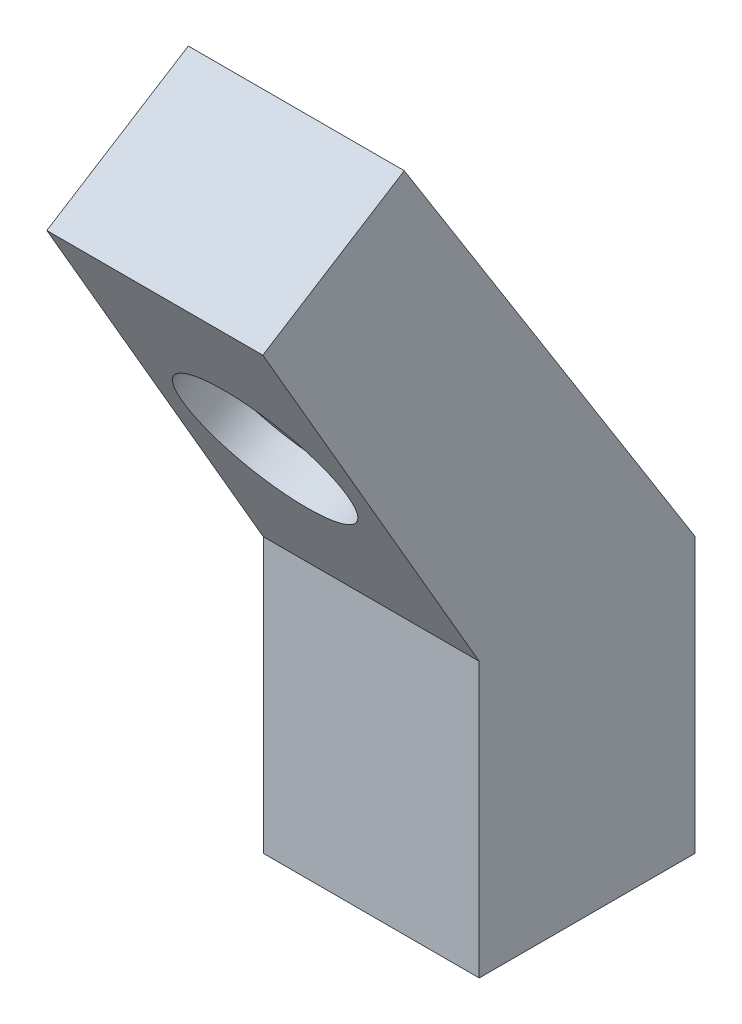
ISO-10303-21;
HEADER;
FILE_DESCRIPTION(('STEP AP214'),'2;1');
FILE_NAME('part.step','',(''),(''),'','','');
FILE_SCHEMA(('AUTOMOTIVE_DESIGN { 1 0 10303 214 1 1 1 1 }'));
ENDSEC;
DATA;
#1=APPLICATION_CONTEXT('core data for automotive mechanical design processes');
#2=APPLICATION_PROTOCOL_DEFINITION('international standard','automotive_design',2000,#1);
#3=PRODUCT_CONTEXT('',#1,'mechanical');
#4=PRODUCT('Part','Part','',(#3));
#5=PRODUCT_RELATED_PRODUCT_CATEGORY('part','',(#4));
#6=PRODUCT_DEFINITION_FORMATION('','',#4);
#7=PRODUCT_DEFINITION_CONTEXT('part definition',#1,'design');
#8=PRODUCT_DEFINITION('design','',#6,#7);
#9=PRODUCT_DEFINITION_SHAPE('','',#8);
#10=(LENGTH_UNIT() NAMED_UNIT(*) SI_UNIT(.MILLI.,.METRE.));
#11=(NAMED_UNIT(*) PLANE_ANGLE_UNIT() SI_UNIT($,.RADIAN.));
#12=(NAMED_UNIT(*) SI_UNIT($,.STERADIAN.) SOLID_ANGLE_UNIT());
#13=UNCERTAINTY_MEASURE_WITH_UNIT(LENGTH_MEASURE(1.E-05),#10,'distance_accuracy_value','');
#14=(GEOMETRIC_REPRESENTATION_CONTEXT(3) GLOBAL_UNCERTAINTY_ASSIGNED_CONTEXT((#13)) GLOBAL_UNIT_ASSIGNED_CONTEXT((#10,
#11,#12)) REPRESENTATION_CONTEXT('',''));
#15=CARTESIAN_POINT('',(0.,0.,0.));
#16=DIRECTION('',(0.,0.,1.));
#17=DIRECTION('',(1.,0.,0.));
#18=AXIS2_PLACEMENT_3D('',#15,#16,#17);
#19=CARTESIAN_POINT('',(-80.,203.2,0.));
#20=DIRECTION('',(1.,0.,0.));
#21=DIRECTION('',(0.,0.,-1.));
#22=AXIS2_PLACEMENT_3D('',#19,#20,#21);
#23=PLANE('',#22);
#24=DIRECTION('',(0.,0.,1.));
#25=VECTOR('',#24,1.);
#26=CARTESIAN_POINT('',(-80.,0.,0.));
#27=LINE('',#26,#25);
#28=CARTESIAN_POINT('',(-80.,0.,-80.));
#29=VERTEX_POINT('',#28);
#30=CARTESIAN_POINT('',(-80.,0.,80.));
#31=VERTEX_POINT('',#30);
#32=EDGE_CURVE('E82',#29,#31,#27,.T.);
#33=ORIENTED_EDGE('',*,*,#32,.T.);
#34=DIRECTION('',(0.,-1.,0.));
#35=VECTOR('',#34,1.);
#36=CARTESIAN_POINT('',(-80.,203.2,80.));
#37=LINE('',#36,#35);
#38=CARTESIAN_POINT('',(-80.,203.2,80.));
#39=VERTEX_POINT('',#38);
#40=EDGE_CURVE('E11',#39,#31,#37,.T.);
#41=ORIENTED_EDGE('',*,*,#40,.F.);
#42=DIRECTION('',(0.,0.,1.));
#43=VECTOR('',#42,1.);
#44=CARTESIAN_POINT('',(-80.,203.2,-80.));
#45=LINE('',#44,#43);
#46=CARTESIAN_POINT('',(-80.,203.2,-80.));
#47=VERTEX_POINT('',#46);
#48=EDGE_CURVE('E167',#47,#39,#45,.T.);
#49=ORIENTED_EDGE('',*,*,#48,.F.);
#50=DIRECTION('',(0.,-1.,0.));
#51=VECTOR('',#50,1.);
#52=CARTESIAN_POINT('',(-80.,203.2,-80.));
#53=LINE('',#52,#51);
#54=EDGE_CURVE('E62',#47,#29,#53,.T.);
#55=ORIENTED_EDGE('',*,*,#54,.T.);
#56=EDGE_LOOP('',(#33,#41,#49,#55));
#57=FACE_BOUND('',#56,.T.);
#58=ADVANCED_FACE('F45',(#57),#23,.F.);
#59=CARTESIAN_POINT('',(80.,203.2,80.));
#60=DIRECTION('',(0.,0.,1.));
#61=DIRECTION('',(1.,0.,0.));
#62=AXIS2_PLACEMENT_3D('',#59,#60,#61);
#63=PLANE('',#62);
#64=DIRECTION('',(-1.,0.,0.));
#65=VECTOR('',#64,1.);
#66=CARTESIAN_POINT('',(80.,0.,80.));
#67=LINE('',#66,#65);
#68=CARTESIAN_POINT('',(80.,0.,80.));
#69=VERTEX_POINT('',#68);
#70=EDGE_CURVE('E180',#69,#31,#67,.T.);
#71=ORIENTED_EDGE('',*,*,#70,.F.);
#72=DIRECTION('',(0.,-1.,0.));
#73=VECTOR('',#72,1.);
#74=CARTESIAN_POINT('',(80.,203.2,80.));
#75=LINE('',#74,#73);
#76=CARTESIAN_POINT('',(80.,203.2,80.));
#77=VERTEX_POINT('',#76);
#78=EDGE_CURVE('E54',#77,#69,#75,.T.);
#79=ORIENTED_EDGE('',*,*,#78,.F.);
#80=DIRECTION('',(1.,0.,0.));
#81=VECTOR('',#80,1.);
#82=CARTESIAN_POINT('',(-80.,203.2,80.));
#83=LINE('',#82,#81);
#84=EDGE_CURVE('E171',#39,#77,#83,.T.);
#85=ORIENTED_EDGE('',*,*,#84,.F.);
#86=ORIENTED_EDGE('',*,*,#40,.T.);
#87=EDGE_LOOP('',(#71,#79,#85,#86));
#88=FACE_BOUND('',#87,.T.);
#89=ADVANCED_FACE('F196',(#88),#63,.T.);
#90=CARTESIAN_POINT('',(80.,203.2,0.));
#91=DIRECTION('',(-1.,0.,0.));
#92=DIRECTION('',(0.,0.,1.));
#93=AXIS2_PLACEMENT_3D('',#90,#91,#92);
#94=PLANE('',#93);
#95=DIRECTION('',(0.,0.,-1.));
#96=VECTOR('',#95,1.);
#97=CARTESIAN_POINT('',(80.,0.,0.));
#98=LINE('',#97,#96);
#99=CARTESIAN_POINT('',(80.,0.,-80.));
#100=VERTEX_POINT('',#99);
#101=EDGE_CURVE('E183',#69,#100,#98,.T.);
#102=ORIENTED_EDGE('',*,*,#101,.T.);
#103=DIRECTION('',(0.,-1.,0.));
#104=VECTOR('',#103,1.);
#105=CARTESIAN_POINT('',(80.,203.2,-80.));
#106=LINE('',#105,#104);
#107=CARTESIAN_POINT('',(80.,203.2,-80.));
#108=VERTEX_POINT('',#107);
#109=EDGE_CURVE('E190',#108,#100,#106,.T.);
#110=ORIENTED_EDGE('',*,*,#109,.F.);
#111=DIRECTION('',(0.,0.846387073175883,0.532568232586926));
#112=VECTOR('',#111,1.);
#113=CARTESIAN_POINT('',(80.,203.2,-80.));
#114=LINE('',#113,#112);
#115=CARTESIAN_POINT('',(80.,545.72614690566,135.52614690566));
#116=VERTEX_POINT('',#115);
#117=EDGE_CURVE('E140',#108,#116,#114,.T.);
#118=ORIENTED_EDGE('',*,*,#117,.T.);
#119=DIRECTION('',(0.,-0.532568232586926,0.846387073175883));
#120=VECTOR('',#119,1.);
#121=CARTESIAN_POINT('',(80.,545.72614690566,135.52614690566));
#122=LINE('',#121,#120);
#123=CARTESIAN_POINT('',(80.,479.77624244122,240.337405257941));
#124=VERTEX_POINT('',#123);
#125=EDGE_CURVE('E153',#116,#124,#122,.T.);
#126=ORIENTED_EDGE('',*,*,#125,.T.);
#127=DIRECTION('',(0.,-0.865135452449461,-0.501538282601704));
#128=VECTOR('',#127,1.);
#129=CARTESIAN_POINT('',(80.,479.77624244122,240.337405257941));
#130=LINE('',#129,#128);
#131=EDGE_CURVE('E117',#124,#77,#130,.T.);
#132=ORIENTED_EDGE('',*,*,#131,.T.);
#133=ORIENTED_EDGE('',*,*,#78,.T.);
#134=EDGE_LOOP('',(#102,#110,#118,#126,#132,#133));
#135=FACE_BOUND('',#134,.T.);
#136=ADVANCED_FACE('F195',(#135),#94,.F.);
#137=CARTESIAN_POINT('',(0.,203.2,-80.));
#138=DIRECTION('',(0.,0.,1.));
#139=DIRECTION('',(1.,0.,0.));
#140=AXIS2_PLACEMENT_3D('',#137,#138,#139);
#141=PLANE('',#140);
#142=DIRECTION('',(-1.,0.,0.));
#143=VECTOR('',#142,1.);
#144=CARTESIAN_POINT('',(0.,0.,-80.));
#145=LINE('',#144,#143);
#146=EDGE_CURVE('E79',#100,#29,#145,.T.);
#147=ORIENTED_EDGE('',*,*,#146,.T.);
#148=ORIENTED_EDGE('',*,*,#54,.F.);
#149=DIRECTION('',(-1.,0.,0.));
#150=VECTOR('',#149,1.);
#151=CARTESIAN_POINT('',(80.,203.2,-80.));
#152=LINE('',#151,#150);
#153=EDGE_CURVE('E174',#108,#47,#152,.T.);
#154=ORIENTED_EDGE('',*,*,#153,.F.);
#155=ORIENTED_EDGE('',*,*,#109,.T.);
#156=EDGE_LOOP('',(#147,#148,#154,#155));
#157=FACE_BOUND('',#156,.T.);
#158=ADVANCED_FACE('F205',(#157),#141,.F.);
#159=CARTESIAN_POINT('',(0.,0.,0.));
#160=DIRECTION('',(0.,1.,0.));
#161=DIRECTION('',(0.,0.,1.));
#162=AXIS2_PLACEMENT_3D('',#159,#160,#161);
#163=PLANE('',#162);
#164=ORIENTED_EDGE('',*,*,#32,.F.);
#165=ORIENTED_EDGE('',*,*,#146,.F.);
#166=ORIENTED_EDGE('',*,*,#101,.F.);
#167=ORIENTED_EDGE('',*,*,#70,.T.);
#168=EDGE_LOOP('',(#164,#165,#166,#167));
#169=FACE_BOUND('',#168,.T.);
#170=ADVANCED_FACE('F198',(#169),#163,.F.);
#171=CARTESIAN_POINT('',(-80.02,545.72614690566,135.52614690566));
#172=DIRECTION('',(0.,0.846387073175883,0.532568232586926));
#173=DIRECTION('',(0.,-0.532568232586926,0.846387073175883));
#174=AXIS2_PLACEMENT_3D('',#171,#172,#173);
#175=PLANE('',#174);
#176=ORIENTED_EDGE('',*,*,#125,.F.);
#177=DIRECTION('',(1.,0.,0.));
#178=VECTOR('',#177,1.);
#179=CARTESIAN_POINT('',(-80.02,545.72614690566,135.52614690566));
#180=LINE('',#179,#178);
#181=CARTESIAN_POINT('',(-80.02,545.72614690566,135.52614690566));
#182=VERTEX_POINT('',#181);
#183=EDGE_CURVE('E138',#182,#116,#180,.T.);
#184=ORIENTED_EDGE('',*,*,#183,.F.);
#185=DIRECTION('',(0.,-0.532568232586926,0.846387073175883));
#186=VECTOR('',#185,1.);
#187=CARTESIAN_POINT('',(-80.02,545.72614690566,135.52614690566));
#188=LINE('',#187,#186);
#189=CARTESIAN_POINT('',(-80.02,479.77624244122,240.337405257941));
#190=VERTEX_POINT('',#189);
#191=EDGE_CURVE('E131',#182,#190,#188,.T.);
#192=ORIENTED_EDGE('',*,*,#191,.T.);
#193=DIRECTION('',(1.,0.,0.));
#194=VECTOR('',#193,1.);
#195=CARTESIAN_POINT('',(-80.02,479.77624244122,240.337405257941));
#196=LINE('',#195,#194);
#197=EDGE_CURVE('E111',#190,#124,#196,.T.);
#198=ORIENTED_EDGE('',*,*,#197,.T.);
#199=EDGE_LOOP('',(#176,#184,#192,#198));
#200=FACE_BOUND('',#199,.T.);
#201=ADVANCED_FACE('F137',(#200),#175,.T.);
#202=CARTESIAN_POINT('',(-80.02,203.2,-80.));
#203=DIRECTION('',(0.,0.532568232586926,-0.846387073175883));
#204=DIRECTION('',(0.,0.846387073175883,0.532568232586926));
#205=AXIS2_PLACEMENT_3D('',#202,#203,#204);
#206=PLANE('',#205);
#207=ORIENTED_EDGE('',*,*,#117,.F.);
#208=ORIENTED_EDGE('',*,*,#153,.T.);
#209=DIRECTION('',(1.,0.,0.));
#210=VECTOR('',#209,1.);
#211=CARTESIAN_POINT('',(-80.02,203.2,-80.));
#212=LINE('',#211,#210);
#213=CARTESIAN_POINT('',(-80.02,203.2,-80.));
#214=VERTEX_POINT('',#213);
#215=EDGE_CURVE('E161',#214,#47,#212,.T.);
#216=ORIENTED_EDGE('',*,*,#215,.F.);
#217=DIRECTION('',(0.,0.846387073175883,0.532568232586926));
#218=VECTOR('',#217,1.);
#219=CARTESIAN_POINT('',(-80.02,203.2,-80.));
#220=LINE('',#219,#218);
#221=EDGE_CURVE('E124',#214,#182,#220,.T.);
#222=ORIENTED_EDGE('',*,*,#221,.T.);
#223=ORIENTED_EDGE('',*,*,#183,.T.);
#224=EDGE_LOOP('',(#207,#208,#216,#222,#223));
#225=FACE_BOUND('',#224,.T.);
#226=ADVANCED_FACE('F203',(#225),#206,.T.);
#227=CARTESIAN_POINT('',(-80.02,203.2,80.));
#228=DIRECTION('',(0.,-1.,0.));
#229=DIRECTION('',(0.,0.,-1.));
#230=AXIS2_PLACEMENT_3D('',#227,#228,#229);
#231=PLANE('',#230);
#232=ORIENTED_EDGE('',*,*,#215,.T.);
#233=ORIENTED_EDGE('',*,*,#48,.T.);
#234=DIRECTION('',(1.,0.,0.));
#235=VECTOR('',#234,1.);
#236=CARTESIAN_POINT('',(-80.02,203.2,80.));
#237=LINE('',#236,#235);
#238=CARTESIAN_POINT('',(-80.02,203.2,80.));
#239=VERTEX_POINT('',#238);
#240=EDGE_CURVE('E123',#239,#39,#237,.T.);
#241=ORIENTED_EDGE('',*,*,#240,.F.);
#242=DIRECTION('',(0.,0.,-1.));
#243=VECTOR('',#242,1.);
#244=CARTESIAN_POINT('',(-80.02,203.2,80.));
#245=LINE('',#244,#243);
#246=EDGE_CURVE('E134',#239,#214,#245,.T.);
#247=ORIENTED_EDGE('',*,*,#246,.T.);
#248=EDGE_LOOP('',(#232,#233,#241,#247));
#249=FACE_BOUND('',#248,.T.);
#250=ADVANCED_FACE('F204',(#249),#231,.T.);
#251=CARTESIAN_POINT('',(-80.02,479.77624244122,240.337405257941));
#252=DIRECTION('',(0.,-0.501538282601704,0.865135452449461));
#253=DIRECTION('',(0.,-0.865135452449461,-0.501538282601704));
#254=AXIS2_PLACEMENT_3D('',#251,#252,#253);
#255=PLANE('',#254);
#256=CARTESIAN_POINT('',(0.,338.766357223007,158.590835443965));
#257=DIRECTION('',(0.,-0.501538282601704,0.865135452449461));
#258=DIRECTION('',(0.,-0.865135452449461,-0.501538282601704));
#259=AXIS2_PLACEMENT_3D('',#256,#257,#258);
#260=CIRCLE('',#259,61.468);
#261=CARTESIAN_POINT('',(0.,285.588211231843,127.762280289004));
#262=VERTEX_POINT('',#261);
#263=EDGE_CURVE('E146',#262,#262,#260,.T.);
#264=ORIENTED_EDGE('',*,*,#263,.F.);
#265=EDGE_LOOP('',(#264));
#266=FACE_BOUND('',#265,.T.);
#267=ORIENTED_EDGE('',*,*,#131,.F.);
#268=ORIENTED_EDGE('',*,*,#197,.F.);
#269=DIRECTION('',(0.,-0.865135452449461,-0.501538282601704));
#270=VECTOR('',#269,1.);
#271=CARTESIAN_POINT('',(-80.02,479.77624244122,240.337405257941));
#272=LINE('',#271,#270);
#273=EDGE_CURVE('E115',#190,#239,#272,.T.);
#274=ORIENTED_EDGE('',*,*,#273,.T.);
#275=ORIENTED_EDGE('',*,*,#240,.T.);
#276=ORIENTED_EDGE('',*,*,#84,.T.);
#277=EDGE_LOOP('',(#267,#268,#274,#275,#276));
#278=FACE_BOUND('',#277,.T.);
#279=ADVANCED_FACE('F113',(#266,#278),#255,.T.);
#280=CARTESIAN_POINT('',(-80.02,0.,0.));
#281=DIRECTION('',(-1.,0.,0.));
#282=DIRECTION('',(0.,0.,1.));
#283=AXIS2_PLACEMENT_3D('',#280,#281,#282);
#284=PLANE('',#283);
#285=ORIENTED_EDGE('',*,*,#191,.F.);
#286=ORIENTED_EDGE('',*,*,#221,.F.);
#287=ORIENTED_EDGE('',*,*,#246,.F.);
#288=ORIENTED_EDGE('',*,*,#273,.F.);
#289=EDGE_LOOP('',(#285,#286,#287,#288));
#290=FACE_BOUND('',#289,.T.);
#291=ADVANCED_FACE('F129',(#290),#284,.T.);
#292=CARTESIAN_POINT('',(0.,351.50542960109,136.616394951749));
#293=DIRECTION('',(0.,-0.501538282601704,0.865135452449461));
#294=DIRECTION('',(0.,-0.865135452449461,-0.501538282601704));
#295=AXIS2_PLACEMENT_3D('',#292,#293,#294);
#296=CYLINDRICAL_SURFACE('',#295,61.468);
#297=CARTESIAN_POINT('',(0.,351.50542960109,136.616394951749));
#298=DIRECTION('',(0.,-0.501538282601704,0.865135452449461));
#299=DIRECTION('',(0.,-0.865135452449461,-0.501538282601704));
#300=AXIS2_PLACEMENT_3D('',#297,#298,#299);
#301=CIRCLE('',#300,61.468);
#302=CARTESIAN_POINT('',(0.,298.327283609927,105.787839796787));
#303=VERTEX_POINT('',#302);
#304=EDGE_CURVE('E156',#303,#303,#301,.T.);
#305=ORIENTED_EDGE('',*,*,#304,.F.);
#306=EDGE_LOOP('',(#305));
#307=FACE_BOUND('',#306,.T.);
#308=ORIENTED_EDGE('',*,*,#263,.T.);
#309=EDGE_LOOP('',(#308));
#310=FACE_BOUND('',#309,.T.);
#311=ADVANCED_FACE('F269',(#307,#310),#296,.F.);
#312=CARTESIAN_POINT('',(0.,351.50542960109,136.616394951749));
#313=DIRECTION('',(0.,-0.501538282601704,0.865135452449461));
#314=DIRECTION('',(0.,-0.865135452449461,-0.501538282601704));
#315=AXIS2_PLACEMENT_3D('',#312,#313,#314);
#316=PLANE('',#315);
#317=ORIENTED_EDGE('',*,*,#304,.T.);
#318=EDGE_LOOP('',(#317));
#319=FACE_BOUND('',#318,.T.);
#320=ADVANCED_FACE('F287',(#319),#316,.T.);
#321=CLOSED_SHELL('',(#58,#89,#136,#158,#170,#201,#226,#250,#279,#291,#311,#320));
#322=MANIFOLD_SOLID_BREP('B2',#321);
#323=ADVANCED_BREP_SHAPE_REPRESENTATION('',(#18,#322),#14);
#324=SHAPE_DEFINITION_REPRESENTATION(#9,#323);
ENDSEC;
END-ISO-10303-21;
